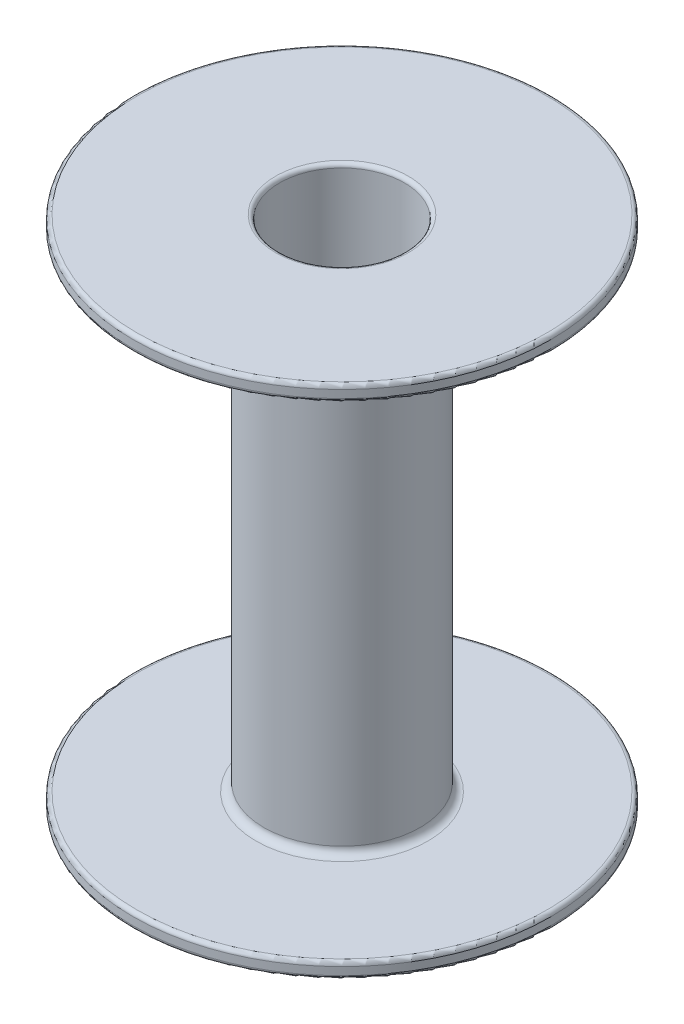
ISO-10303-21;
HEADER;
FILE_DESCRIPTION(('STEP AP214'),'2;1');
FILE_NAME('part.step','',(''),(''),'','','');
FILE_SCHEMA(('AUTOMOTIVE_DESIGN { 1 0 10303 214 1 1 1 1 }'));
ENDSEC;
DATA;
#1=APPLICATION_CONTEXT('core data for automotive mechanical design processes');
#2=APPLICATION_PROTOCOL_DEFINITION('international standard','automotive_design',2000,#1);
#3=PRODUCT_CONTEXT('',#1,'mechanical');
#4=PRODUCT('Part','Part','',(#3));
#5=PRODUCT_RELATED_PRODUCT_CATEGORY('part','',(#4));
#6=PRODUCT_DEFINITION_FORMATION('','',#4);
#7=PRODUCT_DEFINITION_CONTEXT('part definition',#1,'design');
#8=PRODUCT_DEFINITION('design','',#6,#7);
#9=PRODUCT_DEFINITION_SHAPE('','',#8);
#10=(LENGTH_UNIT() NAMED_UNIT(*) SI_UNIT(.MILLI.,.METRE.));
#11=(NAMED_UNIT(*) PLANE_ANGLE_UNIT() SI_UNIT($,.RADIAN.));
#12=(NAMED_UNIT(*) SI_UNIT($,.STERADIAN.) SOLID_ANGLE_UNIT());
#13=UNCERTAINTY_MEASURE_WITH_UNIT(LENGTH_MEASURE(1.E-05),#10,'distance_accuracy_value','');
#14=(GEOMETRIC_REPRESENTATION_CONTEXT(3) GLOBAL_UNCERTAINTY_ASSIGNED_CONTEXT((#13)) GLOBAL_UNIT_ASSIGNED_CONTEXT((#10,
#11,#12)) REPRESENTATION_CONTEXT('',''));
#15=CARTESIAN_POINT('',(0.,0.,0.));
#16=DIRECTION('',(0.,0.,1.));
#17=DIRECTION('',(1.,0.,0.));
#18=AXIS2_PLACEMENT_3D('',#15,#16,#17);
#19=CARTESIAN_POINT('',(0.,-25.1560416964669,0.));
#20=DIRECTION('',(0.,1.,0.));
#21=DIRECTION('',(0.,0.,1.));
#22=AXIS2_PLACEMENT_3D('',#19,#20,#21);
#23=TOROIDAL_SURFACE('',#22,11.,1.);
#24=CARTESIAN_POINT('',(0.,-25.1560416964669,0.));
#25=DIRECTION('',(0.,1.,0.));
#26=DIRECTION('',(0.,0.,1.));
#27=AXIS2_PLACEMENT_3D('',#24,#25,#26);
#28=CIRCLE('',#27,10.);
#29=CARTESIAN_POINT('',(0.,-25.1560416964669,10.));
#30=VERTEX_POINT('',#29);
#31=EDGE_CURVE('E10',#30,#30,#28,.T.);
#32=ORIENTED_EDGE('',*,*,#31,.F.);
#33=EDGE_LOOP('',(#32));
#34=FACE_BOUND('',#33,.T.);
#35=CARTESIAN_POINT('',(0.,-26.1560416964669,0.));
#36=DIRECTION('',(0.,1.,0.));
#37=DIRECTION('',(0.,0.,1.));
#38=AXIS2_PLACEMENT_3D('',#35,#36,#37);
#39=CIRCLE('',#38,11.);
#40=CARTESIAN_POINT('',(0.,-26.1560416964669,11.));
#41=VERTEX_POINT('',#40);
#42=EDGE_CURVE('E85',#41,#41,#39,.T.);
#43=ORIENTED_EDGE('',*,*,#42,.T.);
#44=EDGE_LOOP('',(#43));
#45=FACE_BOUND('',#44,.T.);
#46=ADVANCED_FACE('F33',(#34,#45),#23,.F.);
#47=CARTESIAN_POINT('',(0.,20.9742107709913,0.));
#48=DIRECTION('',(0.,1.,0.));
#49=DIRECTION('',(0.,0.,1.));
#50=AXIS2_PLACEMENT_3D('',#47,#48,#49);
#51=CYLINDRICAL_SURFACE('',#50,10.);
#52=CARTESIAN_POINT('',(0.,35.3439583035331,0.));
#53=DIRECTION('',(0.,1.,0.));
#54=DIRECTION('',(0.,0.,1.));
#55=AXIS2_PLACEMENT_3D('',#52,#53,#54);
#56=CIRCLE('',#55,10.);
#57=CARTESIAN_POINT('',(0.,35.3439583035331,10.));
#58=VERTEX_POINT('',#57);
#59=EDGE_CURVE('E39',#58,#58,#56,.T.);
#60=ORIENTED_EDGE('',*,*,#59,.F.);
#61=EDGE_LOOP('',(#60));
#62=FACE_BOUND('',#61,.T.);
#63=ORIENTED_EDGE('',*,*,#31,.T.);
#64=EDGE_LOOP('',(#63));
#65=FACE_BOUND('',#64,.T.);
#66=ADVANCED_FACE('F170',(#62,#65),#51,.T.);
#67=CARTESIAN_POINT('',(0.,35.3439583035331,0.));
#68=DIRECTION('',(0.,1.,0.));
#69=DIRECTION('',(0.,0.,1.));
#70=AXIS2_PLACEMENT_3D('',#67,#68,#69);
#71=TOROIDAL_SURFACE('',#70,10.5,0.500000000000004);
#72=CARTESIAN_POINT('',(0.,35.8439583035331,0.));
#73=DIRECTION('',(0.,1.,0.));
#74=DIRECTION('',(0.,0.,1.));
#75=AXIS2_PLACEMENT_3D('',#72,#73,#74);
#76=CIRCLE('',#75,10.5);
#77=CARTESIAN_POINT('',(0.,35.8439583035331,10.5));
#78=VERTEX_POINT('',#77);
#79=EDGE_CURVE('E43',#78,#78,#76,.T.);
#80=ORIENTED_EDGE('',*,*,#79,.F.);
#81=EDGE_LOOP('',(#80));
#82=FACE_BOUND('',#81,.T.);
#83=ORIENTED_EDGE('',*,*,#59,.T.);
#84=EDGE_LOOP('',(#83));
#85=FACE_BOUND('',#84,.T.);
#86=ADVANCED_FACE('F165',(#82,#85),#71,.F.);
#87=CARTESIAN_POINT('',(26.26,35.8439583035331,0.));
#88=DIRECTION('',(0.,1.,0.));
#89=DIRECTION('',(0.,0.,1.));
#90=AXIS2_PLACEMENT_3D('',#87,#88,#89);
#91=PLANE('',#90);
#92=CARTESIAN_POINT('',(0.,35.8439583035331,0.));
#93=DIRECTION('',(0.,1.,0.));
#94=DIRECTION('',(0.,0.,1.));
#95=AXIS2_PLACEMENT_3D('',#92,#93,#94);
#96=CIRCLE('',#95,26.26);
#97=CARTESIAN_POINT('',(0.,35.8439583035331,26.26));
#98=VERTEX_POINT('',#97);
#99=EDGE_CURVE('E47',#98,#98,#96,.T.);
#100=ORIENTED_EDGE('',*,*,#99,.F.);
#101=EDGE_LOOP('',(#100));
#102=FACE_BOUND('',#101,.T.);
#103=ORIENTED_EDGE('',*,*,#79,.T.);
#104=EDGE_LOOP('',(#103));
#105=FACE_BOUND('',#104,.T.);
#106=ADVANCED_FACE('F159',(#102,#105),#91,.F.);
#107=CARTESIAN_POINT('',(0.,36.3439583035331,0.));
#108=DIRECTION('',(0.,1.,0.));
#109=DIRECTION('',(0.,0.,1.));
#110=AXIS2_PLACEMENT_3D('',#107,#108,#109);
#111=TOROIDAL_SURFACE('',#110,26.26,0.500000000000007);
#112=CARTESIAN_POINT('',(0.,36.3439583035331,0.));
#113=DIRECTION('',(0.,1.,0.));
#114=DIRECTION('',(0.,0.,1.));
#115=AXIS2_PLACEMENT_3D('',#112,#113,#114);
#116=CIRCLE('',#115,26.76);
#117=CARTESIAN_POINT('',(0.,36.3439583035331,26.76));
#118=VERTEX_POINT('',#117);
#119=EDGE_CURVE('E52',#118,#118,#116,.T.);
#120=ORIENTED_EDGE('',*,*,#119,.F.);
#121=EDGE_LOOP('',(#120));
#122=FACE_BOUND('',#121,.T.);
#123=ORIENTED_EDGE('',*,*,#99,.T.);
#124=EDGE_LOOP('',(#123));
#125=FACE_BOUND('',#124,.T.);
#126=ADVANCED_FACE('F153',(#122,#125),#111,.T.);
#127=CARTESIAN_POINT('',(0.,20.9742107709913,0.));
#128=DIRECTION('',(0.,1.,0.));
#129=DIRECTION('',(0.,0.,1.));
#130=AXIS2_PLACEMENT_3D('',#127,#128,#129);
#131=CYLINDRICAL_SURFACE('',#130,26.76);
#132=CARTESIAN_POINT('',(0.,37.3439583035331,0.));
#133=DIRECTION('',(0.,1.,0.));
#134=DIRECTION('',(0.,0.,1.));
#135=AXIS2_PLACEMENT_3D('',#132,#133,#134);
#136=CIRCLE('',#135,26.76);
#137=CARTESIAN_POINT('',(0.,37.3439583035331,26.76));
#138=VERTEX_POINT('',#137);
#139=EDGE_CURVE('E55',#138,#138,#136,.T.);
#140=ORIENTED_EDGE('',*,*,#139,.F.);
#141=EDGE_LOOP('',(#140));
#142=FACE_BOUND('',#141,.T.);
#143=ORIENTED_EDGE('',*,*,#119,.T.);
#144=EDGE_LOOP('',(#143));
#145=FACE_BOUND('',#144,.T.);
#146=ADVANCED_FACE('F147',(#142,#145),#131,.T.);
#147=CARTESIAN_POINT('',(0.,37.3439583035331,0.));
#148=DIRECTION('',(0.,1.,0.));
#149=DIRECTION('',(0.,0.,1.));
#150=AXIS2_PLACEMENT_3D('',#147,#148,#149);
#151=TOROIDAL_SURFACE('',#150,26.26,0.5);
#152=CARTESIAN_POINT('',(0.,37.8439583035331,0.));
#153=DIRECTION('',(0.,1.,0.));
#154=DIRECTION('',(0.,0.,1.));
#155=AXIS2_PLACEMENT_3D('',#152,#153,#154);
#156=CIRCLE('',#155,26.26);
#157=CARTESIAN_POINT('',(0.,37.8439583035331,26.26));
#158=VERTEX_POINT('',#157);
#159=EDGE_CURVE('E58',#158,#158,#156,.T.);
#160=ORIENTED_EDGE('',*,*,#159,.F.);
#161=EDGE_LOOP('',(#160));
#162=FACE_BOUND('',#161,.T.);
#163=ORIENTED_EDGE('',*,*,#139,.T.);
#164=EDGE_LOOP('',(#163));
#165=FACE_BOUND('',#164,.T.);
#166=ADVANCED_FACE('F141',(#162,#165),#151,.T.);
#167=CARTESIAN_POINT('',(8.50000000000001,37.8439583035331,0.));
#168=DIRECTION('',(0.,-1.,0.));
#169=DIRECTION('',(0.,0.,-1.));
#170=AXIS2_PLACEMENT_3D('',#167,#168,#169);
#171=PLANE('',#170);
#172=CARTESIAN_POINT('',(0.,37.8439583035331,0.));
#173=DIRECTION('',(0.,1.,0.));
#174=DIRECTION('',(0.,0.,1.));
#175=AXIS2_PLACEMENT_3D('',#172,#173,#174);
#176=CIRCLE('',#175,8.50000000000001);
#177=CARTESIAN_POINT('',(0.,37.8439583035331,8.50000000000001));
#178=VERTEX_POINT('',#177);
#179=EDGE_CURVE('E61',#178,#178,#176,.T.);
#180=ORIENTED_EDGE('',*,*,#179,.F.);
#181=EDGE_LOOP('',(#180));
#182=FACE_BOUND('',#181,.T.);
#183=ORIENTED_EDGE('',*,*,#159,.T.);
#184=EDGE_LOOP('',(#183));
#185=FACE_BOUND('',#184,.T.);
#186=ADVANCED_FACE('F135',(#182,#185),#171,.F.);
#187=CARTESIAN_POINT('',(0.,37.3439583035331,0.));
#188=DIRECTION('',(0.,1.,0.));
#189=DIRECTION('',(0.,0.,1.));
#190=AXIS2_PLACEMENT_3D('',#187,#188,#189);
#191=TOROIDAL_SURFACE('',#190,8.50000000000001,0.5);
#192=CARTESIAN_POINT('',(0.,37.3439583035331,0.));
#193=DIRECTION('',(0.,1.,0.));
#194=DIRECTION('',(0.,0.,1.));
#195=AXIS2_PLACEMENT_3D('',#192,#193,#194);
#196=CIRCLE('',#195,8.00000000000001);
#197=CARTESIAN_POINT('',(0.,37.3439583035331,8.00000000000001));
#198=VERTEX_POINT('',#197);
#199=EDGE_CURVE('E64',#198,#198,#196,.T.);
#200=ORIENTED_EDGE('',*,*,#199,.F.);
#201=EDGE_LOOP('',(#200));
#202=FACE_BOUND('',#201,.T.);
#203=ORIENTED_EDGE('',*,*,#179,.T.);
#204=EDGE_LOOP('',(#203));
#205=FACE_BOUND('',#204,.T.);
#206=ADVANCED_FACE('F129',(#202,#205),#191,.T.);
#207=CARTESIAN_POINT('',(0.,20.9742107709913,0.));
#208=DIRECTION('',(0.,1.,0.));
#209=DIRECTION('',(0.,0.,1.));
#210=AXIS2_PLACEMENT_3D('',#207,#208,#209);
#211=CYLINDRICAL_SURFACE('',#210,8.00000000000001);
#212=CARTESIAN_POINT('',(0.,-27.6560416964669,0.));
#213=DIRECTION('',(0.,1.,0.));
#214=DIRECTION('',(0.,0.,1.));
#215=AXIS2_PLACEMENT_3D('',#212,#213,#214);
#216=CIRCLE('',#215,8.00000000000001);
#217=CARTESIAN_POINT('',(0.,-27.6560416964669,8.00000000000001));
#218=VERTEX_POINT('',#217);
#219=EDGE_CURVE('E67',#218,#218,#216,.T.);
#220=ORIENTED_EDGE('',*,*,#219,.F.);
#221=EDGE_LOOP('',(#220));
#222=FACE_BOUND('',#221,.T.);
#223=ORIENTED_EDGE('',*,*,#199,.T.);
#224=EDGE_LOOP('',(#223));
#225=FACE_BOUND('',#224,.T.);
#226=ADVANCED_FACE('F123',(#222,#225),#211,.F.);
#227=CARTESIAN_POINT('',(0.,-27.6560416964669,0.));
#228=DIRECTION('',(0.,1.,0.));
#229=DIRECTION('',(0.,0.,1.));
#230=AXIS2_PLACEMENT_3D('',#227,#228,#229);
#231=TOROIDAL_SURFACE('',#230,8.50000000000001,0.5);
#232=CARTESIAN_POINT('',(0.,-28.1560416964669,0.));
#233=DIRECTION('',(0.,1.,0.));
#234=DIRECTION('',(0.,0.,1.));
#235=AXIS2_PLACEMENT_3D('',#232,#233,#234);
#236=CIRCLE('',#235,8.50000000000001);
#237=CARTESIAN_POINT('',(0.,-28.1560416964669,8.50000000000001));
#238=VERTEX_POINT('',#237);
#239=EDGE_CURVE('E70',#238,#238,#236,.T.);
#240=ORIENTED_EDGE('',*,*,#239,.F.);
#241=EDGE_LOOP('',(#240));
#242=FACE_BOUND('',#241,.T.);
#243=ORIENTED_EDGE('',*,*,#219,.T.);
#244=EDGE_LOOP('',(#243));
#245=FACE_BOUND('',#244,.T.);
#246=ADVANCED_FACE('F117',(#242,#245),#231,.T.);
#247=CARTESIAN_POINT('',(8.50000000000001,-28.1560416964669,0.));
#248=DIRECTION('',(0.,1.,0.));
#249=DIRECTION('',(0.,0.,1.));
#250=AXIS2_PLACEMENT_3D('',#247,#248,#249);
#251=PLANE('',#250);
#252=CARTESIAN_POINT('',(0.,-28.1560416964669,0.));
#253=DIRECTION('',(0.,1.,0.));
#254=DIRECTION('',(0.,0.,1.));
#255=AXIS2_PLACEMENT_3D('',#252,#253,#254);
#256=CIRCLE('',#255,26.26);
#257=CARTESIAN_POINT('',(0.,-28.1560416964669,26.26));
#258=VERTEX_POINT('',#257);
#259=EDGE_CURVE('E73',#258,#258,#256,.T.);
#260=ORIENTED_EDGE('',*,*,#259,.F.);
#261=EDGE_LOOP('',(#260));
#262=FACE_BOUND('',#261,.T.);
#263=ORIENTED_EDGE('',*,*,#239,.T.);
#264=EDGE_LOOP('',(#263));
#265=FACE_BOUND('',#264,.T.);
#266=ADVANCED_FACE('F111',(#262,#265),#251,.F.);
#267=CARTESIAN_POINT('',(0.,-27.6560416964669,0.));
#268=DIRECTION('',(0.,1.,0.));
#269=DIRECTION('',(0.,0.,1.));
#270=AXIS2_PLACEMENT_3D('',#267,#268,#269);
#271=TOROIDAL_SURFACE('',#270,26.26,0.5);
#272=CARTESIAN_POINT('',(0.,-27.6560416964669,0.));
#273=DIRECTION('',(0.,1.,0.));
#274=DIRECTION('',(0.,0.,1.));
#275=AXIS2_PLACEMENT_3D('',#272,#273,#274);
#276=CIRCLE('',#275,26.76);
#277=CARTESIAN_POINT('',(0.,-27.6560416964669,26.76));
#278=VERTEX_POINT('',#277);
#279=EDGE_CURVE('E76',#278,#278,#276,.T.);
#280=ORIENTED_EDGE('',*,*,#279,.F.);
#281=EDGE_LOOP('',(#280));
#282=FACE_BOUND('',#281,.T.);
#283=ORIENTED_EDGE('',*,*,#259,.T.);
#284=EDGE_LOOP('',(#283));
#285=FACE_BOUND('',#284,.T.);
#286=ADVANCED_FACE('F105',(#282,#285),#271,.T.);
#287=CARTESIAN_POINT('',(0.,20.9742107709913,0.));
#288=DIRECTION('',(0.,1.,0.));
#289=DIRECTION('',(0.,0.,1.));
#290=AXIS2_PLACEMENT_3D('',#287,#288,#289);
#291=CYLINDRICAL_SURFACE('',#290,26.76);
#292=CARTESIAN_POINT('',(0.,-26.656041696467,0.));
#293=DIRECTION('',(0.,1.,0.));
#294=DIRECTION('',(0.,0.,1.));
#295=AXIS2_PLACEMENT_3D('',#292,#293,#294);
#296=CIRCLE('',#295,26.76);
#297=CARTESIAN_POINT('',(0.,-26.656041696467,26.76));
#298=VERTEX_POINT('',#297);
#299=EDGE_CURVE('E79',#298,#298,#296,.T.);
#300=ORIENTED_EDGE('',*,*,#299,.F.);
#301=EDGE_LOOP('',(#300));
#302=FACE_BOUND('',#301,.T.);
#303=ORIENTED_EDGE('',*,*,#279,.T.);
#304=EDGE_LOOP('',(#303));
#305=FACE_BOUND('',#304,.T.);
#306=ADVANCED_FACE('F99',(#302,#305),#291,.T.);
#307=CARTESIAN_POINT('',(0.,-26.656041696467,0.));
#308=DIRECTION('',(0.,1.,0.));
#309=DIRECTION('',(0.,0.,1.));
#310=AXIS2_PLACEMENT_3D('',#307,#308,#309);
#311=TOROIDAL_SURFACE('',#310,26.26,0.500000000000002);
#312=CARTESIAN_POINT('',(0.,-26.1560416964669,0.));
#313=DIRECTION('',(0.,1.,0.));
#314=DIRECTION('',(0.,0.,1.));
#315=AXIS2_PLACEMENT_3D('',#312,#313,#314);
#316=CIRCLE('',#315,26.26);
#317=CARTESIAN_POINT('',(0.,-26.1560416964669,26.26));
#318=VERTEX_POINT('',#317);
#319=EDGE_CURVE('E82',#318,#318,#316,.T.);
#320=ORIENTED_EDGE('',*,*,#319,.F.);
#321=EDGE_LOOP('',(#320));
#322=FACE_BOUND('',#321,.T.);
#323=ORIENTED_EDGE('',*,*,#299,.T.);
#324=EDGE_LOOP('',(#323));
#325=FACE_BOUND('',#324,.T.);
#326=ADVANCED_FACE('F93',(#322,#325),#311,.T.);
#327=CARTESIAN_POINT('',(26.26,-26.1560416964669,0.));
#328=DIRECTION('',(0.,-1.,0.));
#329=DIRECTION('',(0.,0.,-1.));
#330=AXIS2_PLACEMENT_3D('',#327,#328,#329);
#331=PLANE('',#330);
#332=ORIENTED_EDGE('',*,*,#42,.F.);
#333=EDGE_LOOP('',(#332));
#334=FACE_BOUND('',#333,.T.);
#335=ORIENTED_EDGE('',*,*,#319,.T.);
#336=EDGE_LOOP('',(#335));
#337=FACE_BOUND('',#336,.T.);
#338=ADVANCED_FACE('F90',(#334,#337),#331,.F.);
#339=CLOSED_SHELL('',(#46,#66,#86,#106,#126,#146,#166,#186,#206,#226,#246,#266,#286,#306,#326,#338));
#340=MANIFOLD_SOLID_BREP('B2',#339);
#341=ADVANCED_BREP_SHAPE_REPRESENTATION('',(#18,#340),#14);
#342=SHAPE_DEFINITION_REPRESENTATION(#9,#341);
ENDSEC;
END-ISO-10303-21;
